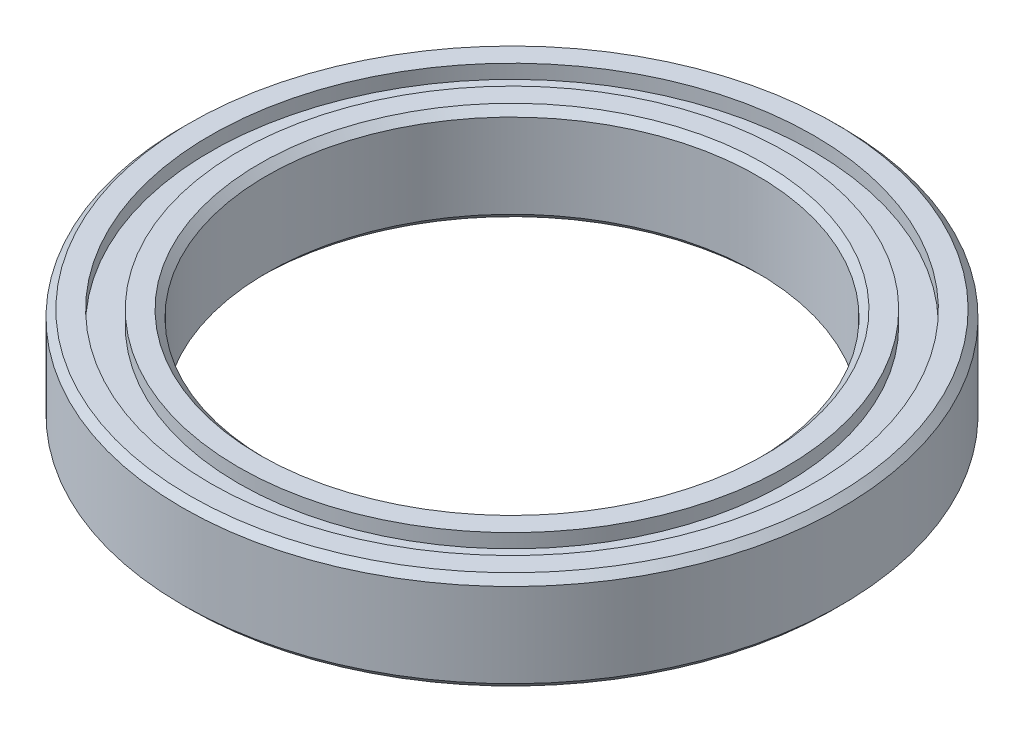
ISO-10303-21;
HEADER;
FILE_DESCRIPTION(('STEP AP214'),'2;1');
FILE_NAME('part.step','',(''),(''),'','','');
FILE_SCHEMA(('AUTOMOTIVE_DESIGN { 1 0 10303 214 1 1 1 1 }'));
ENDSEC;
DATA;
#1=APPLICATION_CONTEXT('core data for automotive mechanical design processes');
#2=APPLICATION_PROTOCOL_DEFINITION('international standard','automotive_design',2000,#1);
#3=PRODUCT_CONTEXT('',#1,'mechanical');
#4=PRODUCT('Part','Part','',(#3));
#5=PRODUCT_RELATED_PRODUCT_CATEGORY('part','',(#4));
#6=PRODUCT_DEFINITION_FORMATION('','',#4);
#7=PRODUCT_DEFINITION_CONTEXT('part definition',#1,'design');
#8=PRODUCT_DEFINITION('design','',#6,#7);
#9=PRODUCT_DEFINITION_SHAPE('','',#8);
#10=(LENGTH_UNIT() NAMED_UNIT(*) SI_UNIT(.MILLI.,.METRE.));
#11=(NAMED_UNIT(*) PLANE_ANGLE_UNIT() SI_UNIT($,.RADIAN.));
#12=(NAMED_UNIT(*) SI_UNIT($,.STERADIAN.) SOLID_ANGLE_UNIT());
#13=UNCERTAINTY_MEASURE_WITH_UNIT(LENGTH_MEASURE(1.E-05),#10,'distance_accuracy_value','');
#14=(GEOMETRIC_REPRESENTATION_CONTEXT(3) GLOBAL_UNCERTAINTY_ASSIGNED_CONTEXT((#13)) GLOBAL_UNIT_ASSIGNED_CONTEXT((#10,
#11,#12)) REPRESENTATION_CONTEXT('',''));
#15=CARTESIAN_POINT('',(0.,0.,0.));
#16=DIRECTION('',(0.,0.,1.));
#17=DIRECTION('',(1.,0.,0.));
#18=AXIS2_PLACEMENT_3D('',#15,#16,#17);
#19=CARTESIAN_POINT('',(0.,0.,0.));
#20=DIRECTION('',(0.,1.,0.));
#21=DIRECTION('',(0.,0.,1.));
#22=AXIS2_PLACEMENT_3D('',#19,#20,#21);
#23=PLANE('',#22);
#24=CARTESIAN_POINT('',(0.,0.,0.));
#25=DIRECTION('',(0.,1.,0.));
#26=DIRECTION('',(0.,0.,1.));
#27=AXIS2_PLACEMENT_3D('',#24,#25,#26);
#28=CIRCLE('',#27,18.);
#29=CARTESIAN_POINT('',(0.,0.,18.));
#30=VERTEX_POINT('',#29);
#31=EDGE_CURVE('E51',#30,#30,#28,.T.);
#32=ORIENTED_EDGE('',*,*,#31,.T.);
#33=EDGE_LOOP('',(#32));
#34=FACE_BOUND('',#33,.T.);
#35=CARTESIAN_POINT('',(0.,0.,0.));
#36=DIRECTION('',(0.,-1.,0.));
#37=DIRECTION('',(0.,0.,-1.));
#38=AXIS2_PLACEMENT_3D('',#35,#36,#37);
#39=CIRCLE('',#38,19.5);
#40=CARTESIAN_POINT('',(0.,0.,-19.5));
#41=VERTEX_POINT('',#40);
#42=EDGE_CURVE('E95',#41,#41,#39,.T.);
#43=ORIENTED_EDGE('',*,*,#42,.T.);
#44=EDGE_LOOP('',(#43));
#45=FACE_BOUND('',#44,.T.);
#46=ADVANCED_FACE('F43',(#34,#45),#23,.F.);
#47=CARTESIAN_POINT('',(0.,7.,0.));
#48=DIRECTION('',(0.,1.,0.));
#49=DIRECTION('',(0.,0.,1.));
#50=AXIS2_PLACEMENT_3D('',#47,#48,#49);
#51=PLANE('',#50);
#52=CARTESIAN_POINT('',(0.,7.,0.));
#53=DIRECTION('',(0.,1.,0.));
#54=DIRECTION('',(0.,0.,1.));
#55=AXIS2_PLACEMENT_3D('',#52,#53,#54);
#56=CIRCLE('',#55,18.);
#57=CARTESIAN_POINT('',(0.,7.,18.));
#58=VERTEX_POINT('',#57);
#59=EDGE_CURVE('E67',#58,#58,#56,.F.);
#60=ORIENTED_EDGE('',*,*,#59,.T.);
#61=EDGE_LOOP('',(#60));
#62=FACE_BOUND('',#61,.T.);
#63=CARTESIAN_POINT('',(0.,7.,0.));
#64=DIRECTION('',(0.,1.,0.));
#65=DIRECTION('',(0.,0.,1.));
#66=AXIS2_PLACEMENT_3D('',#63,#64,#65);
#67=CIRCLE('',#66,19.5);
#68=CARTESIAN_POINT('',(0.,7.,19.5));
#69=VERTEX_POINT('',#68);
#70=EDGE_CURVE('E83',#69,#69,#67,.T.);
#71=ORIENTED_EDGE('',*,*,#70,.T.);
#72=EDGE_LOOP('',(#71));
#73=FACE_BOUND('',#72,.T.);
#74=ADVANCED_FACE('F129',(#62,#73),#51,.T.);
#75=CARTESIAN_POINT('',(0.,7.,0.));
#76=DIRECTION('',(0.,1.,0.));
#77=DIRECTION('',(0.,0.,1.));
#78=AXIS2_PLACEMENT_3D('',#75,#76,#77);
#79=CIRCLE('',#78,23.);
#80=CARTESIAN_POINT('',(0.,7.,23.));
#81=VERTEX_POINT('',#80);
#82=EDGE_CURVE('E64',#81,#81,#79,.T.);
#83=ORIENTED_EDGE('',*,*,#82,.T.);
#84=EDGE_LOOP('',(#83));
#85=FACE_BOUND('',#84,.T.);
#86=CARTESIAN_POINT('',(0.,7.,0.));
#87=DIRECTION('',(0.,1.,0.));
#88=DIRECTION('',(0.,0.,1.));
#89=AXIS2_PLACEMENT_3D('',#86,#87,#88);
#90=CIRCLE('',#89,21.5);
#91=CARTESIAN_POINT('',(0.,7.,21.5));
#92=VERTEX_POINT('',#91);
#93=EDGE_CURVE('E77',#92,#92,#90,.T.);
#94=ORIENTED_EDGE('',*,*,#93,.F.);
#95=EDGE_LOOP('',(#94));
#96=FACE_BOUND('',#95,.T.);
#97=ADVANCED_FACE('F120',(#85,#96),#51,.T.);
#98=CARTESIAN_POINT('',(0.,0.,0.));
#99=DIRECTION('',(0.,1.,0.));
#100=DIRECTION('',(0.,0.,1.));
#101=AXIS2_PLACEMENT_3D('',#98,#99,#100);
#102=CIRCLE('',#101,23.);
#103=CARTESIAN_POINT('',(0.,0.,23.));
#104=VERTEX_POINT('',#103);
#105=EDGE_CURVE('E10',#104,#104,#102,.F.);
#106=ORIENTED_EDGE('',*,*,#105,.T.);
#107=EDGE_LOOP('',(#106));
#108=FACE_BOUND('',#107,.T.);
#109=CARTESIAN_POINT('',(0.,0.,0.));
#110=DIRECTION('',(0.,-1.,0.));
#111=DIRECTION('',(0.,0.,-1.));
#112=AXIS2_PLACEMENT_3D('',#109,#110,#111);
#113=CIRCLE('',#112,21.5);
#114=CARTESIAN_POINT('',(0.,0.,-21.5));
#115=VERTEX_POINT('',#114);
#116=EDGE_CURVE('E89',#115,#115,#113,.T.);
#117=ORIENTED_EDGE('',*,*,#116,.F.);
#118=EDGE_LOOP('',(#117));
#119=FACE_BOUND('',#118,.T.);
#120=ADVANCED_FACE('F117',(#108,#119),#23,.F.);
#121=CARTESIAN_POINT('',(0.,7.,0.));
#122=DIRECTION('',(0.,-1.,0.));
#123=DIRECTION('',(0.,0.,-1.));
#124=AXIS2_PLACEMENT_3D('',#121,#122,#123);
#125=CYLINDRICAL_SURFACE('',#124,23.5);
#126=CARTESIAN_POINT('',(0.,6.50000000000001,0.));
#127=DIRECTION('',(0.,1.,0.));
#128=DIRECTION('',(0.,0.,1.));
#129=AXIS2_PLACEMENT_3D('',#126,#127,#128);
#130=CIRCLE('',#129,23.5);
#131=CARTESIAN_POINT('',(0.,6.50000000000001,23.5));
#132=VERTEX_POINT('',#131);
#133=EDGE_CURVE('E55',#132,#132,#130,.F.);
#134=ORIENTED_EDGE('',*,*,#133,.T.);
#135=EDGE_LOOP('',(#134));
#136=FACE_BOUND('',#135,.T.);
#137=CARTESIAN_POINT('',(0.,0.499999999999997,0.));
#138=DIRECTION('',(0.,1.,0.));
#139=DIRECTION('',(0.,0.,1.));
#140=AXIS2_PLACEMENT_3D('',#137,#138,#139);
#141=CIRCLE('',#140,23.5);
#142=CARTESIAN_POINT('',(0.,0.499999999999997,23.5));
#143=VERTEX_POINT('',#142);
#144=EDGE_CURVE('E59',#143,#143,#141,.T.);
#145=ORIENTED_EDGE('',*,*,#144,.T.);
#146=EDGE_LOOP('',(#145));
#147=FACE_BOUND('',#146,.T.);
#148=ADVANCED_FACE('F119',(#136,#147),#125,.T.);
#149=CARTESIAN_POINT('',(0.,7.,0.));
#150=DIRECTION('',(0.,-1.,0.));
#151=DIRECTION('',(0.,0.,-1.));
#152=AXIS2_PLACEMENT_3D('',#149,#150,#151);
#153=CYLINDRICAL_SURFACE('',#152,17.5);
#154=CARTESIAN_POINT('',(0.,6.5,0.));
#155=DIRECTION('',(0.,1.,0.));
#156=DIRECTION('',(0.,0.,1.));
#157=AXIS2_PLACEMENT_3D('',#154,#155,#156);
#158=CIRCLE('',#157,17.5);
#159=CARTESIAN_POINT('',(0.,6.5,17.5));
#160=VERTEX_POINT('',#159);
#161=EDGE_CURVE('E70',#160,#160,#158,.T.);
#162=ORIENTED_EDGE('',*,*,#161,.T.);
#163=EDGE_LOOP('',(#162));
#164=FACE_BOUND('',#163,.T.);
#165=CARTESIAN_POINT('',(0.,0.500000000000004,0.));
#166=DIRECTION('',(0.,1.,0.));
#167=DIRECTION('',(0.,0.,1.));
#168=AXIS2_PLACEMENT_3D('',#165,#166,#167);
#169=CIRCLE('',#168,17.5);
#170=CARTESIAN_POINT('',(0.,0.500000000000004,17.5));
#171=VERTEX_POINT('',#170);
#172=EDGE_CURVE('E73',#171,#171,#169,.F.);
#173=ORIENTED_EDGE('',*,*,#172,.T.);
#174=EDGE_LOOP('',(#173));
#175=FACE_BOUND('',#174,.T.);
#176=ADVANCED_FACE('F126',(#164,#175),#153,.F.);
#177=CARTESIAN_POINT('',(0.,6.,0.));
#178=DIRECTION('',(0.,1.,0.));
#179=DIRECTION('',(0.,0.,1.));
#180=AXIS2_PLACEMENT_3D('',#177,#178,#179);
#181=CYLINDRICAL_SURFACE('',#180,21.5);
#182=CARTESIAN_POINT('',(0.,6.,0.));
#183=DIRECTION('',(0.,1.,0.));
#184=DIRECTION('',(0.,0.,1.));
#185=AXIS2_PLACEMENT_3D('',#182,#183,#184);
#186=CIRCLE('',#185,21.5);
#187=CARTESIAN_POINT('',(0.,6.,21.5));
#188=VERTEX_POINT('',#187);
#189=EDGE_CURVE('E76',#188,#188,#186,.T.);
#190=ORIENTED_EDGE('',*,*,#189,.F.);
#191=EDGE_LOOP('',(#190));
#192=FACE_BOUND('',#191,.T.);
#193=ORIENTED_EDGE('',*,*,#93,.T.);
#194=EDGE_LOOP('',(#193));
#195=FACE_BOUND('',#194,.T.);
#196=ADVANCED_FACE('F155',(#192,#195),#181,.F.);
#197=CARTESIAN_POINT('',(0.,6.,0.));
#198=DIRECTION('',(0.,1.,0.));
#199=DIRECTION('',(0.,0.,1.));
#200=AXIS2_PLACEMENT_3D('',#197,#198,#199);
#201=PLANE('',#200);
#202=CARTESIAN_POINT('',(0.,6.,0.));
#203=DIRECTION('',(0.,1.,0.));
#204=DIRECTION('',(0.,0.,1.));
#205=AXIS2_PLACEMENT_3D('',#202,#203,#204);
#206=CIRCLE('',#205,19.5);
#207=CARTESIAN_POINT('',(0.,6.,19.5));
#208=VERTEX_POINT('',#207);
#209=EDGE_CURVE('E80',#208,#208,#206,.T.);
#210=ORIENTED_EDGE('',*,*,#209,.F.);
#211=EDGE_LOOP('',(#210));
#212=FACE_BOUND('',#211,.T.);
#213=ORIENTED_EDGE('',*,*,#189,.T.);
#214=EDGE_LOOP('',(#213));
#215=FACE_BOUND('',#214,.T.);
#216=ADVANCED_FACE('F151',(#212,#215),#201,.T.);
#217=CARTESIAN_POINT('',(0.,6.,0.));
#218=DIRECTION('',(0.,1.,0.));
#219=DIRECTION('',(0.,0.,1.));
#220=AXIS2_PLACEMENT_3D('',#217,#218,#219);
#221=CYLINDRICAL_SURFACE('',#220,19.5);
#222=ORIENTED_EDGE('',*,*,#209,.T.);
#223=EDGE_LOOP('',(#222));
#224=FACE_BOUND('',#223,.T.);
#225=ORIENTED_EDGE('',*,*,#70,.F.);
#226=EDGE_LOOP('',(#225));
#227=FACE_BOUND('',#226,.T.);
#228=ADVANCED_FACE('F113',(#224,#227),#221,.T.);
#229=CARTESIAN_POINT('',(0.,1.,0.));
#230=DIRECTION('',(0.,-1.,0.));
#231=DIRECTION('',(0.,0.,-1.));
#232=AXIS2_PLACEMENT_3D('',#229,#230,#231);
#233=CYLINDRICAL_SURFACE('',#232,21.5);
#234=CARTESIAN_POINT('',(0.,1.,0.));
#235=DIRECTION('',(0.,-1.,0.));
#236=DIRECTION('',(0.,0.,-1.));
#237=AXIS2_PLACEMENT_3D('',#234,#235,#236);
#238=CIRCLE('',#237,21.5);
#239=CARTESIAN_POINT('',(0.,1.,-21.5));
#240=VERTEX_POINT('',#239);
#241=EDGE_CURVE('E86',#240,#240,#238,.T.);
#242=ORIENTED_EDGE('',*,*,#241,.F.);
#243=EDGE_LOOP('',(#242));
#244=FACE_BOUND('',#243,.T.);
#245=ORIENTED_EDGE('',*,*,#116,.T.);
#246=EDGE_LOOP('',(#245));
#247=FACE_BOUND('',#246,.T.);
#248=ADVANCED_FACE('F107',(#244,#247),#233,.F.);
#249=CARTESIAN_POINT('',(0.,1.,0.));
#250=DIRECTION('',(0.,-1.,0.));
#251=DIRECTION('',(0.,0.,-1.));
#252=AXIS2_PLACEMENT_3D('',#249,#250,#251);
#253=PLANE('',#252);
#254=CARTESIAN_POINT('',(0.,1.,0.));
#255=DIRECTION('',(0.,-1.,0.));
#256=DIRECTION('',(0.,0.,-1.));
#257=AXIS2_PLACEMENT_3D('',#254,#255,#256);
#258=CIRCLE('',#257,19.5);
#259=CARTESIAN_POINT('',(0.,1.,-19.5));
#260=VERTEX_POINT('',#259);
#261=EDGE_CURVE('E92',#260,#260,#258,.T.);
#262=ORIENTED_EDGE('',*,*,#261,.F.);
#263=EDGE_LOOP('',(#262));
#264=FACE_BOUND('',#263,.T.);
#265=ORIENTED_EDGE('',*,*,#241,.T.);
#266=EDGE_LOOP('',(#265));
#267=FACE_BOUND('',#266,.T.);
#268=ADVANCED_FACE('F104',(#264,#267),#253,.T.);
#269=CARTESIAN_POINT('',(0.,1.,0.));
#270=DIRECTION('',(0.,-1.,0.));
#271=DIRECTION('',(0.,0.,-1.));
#272=AXIS2_PLACEMENT_3D('',#269,#270,#271);
#273=CYLINDRICAL_SURFACE('',#272,19.5);
#274=ORIENTED_EDGE('',*,*,#261,.T.);
#275=EDGE_LOOP('',(#274));
#276=FACE_BOUND('',#275,.T.);
#277=ORIENTED_EDGE('',*,*,#42,.F.);
#278=EDGE_LOOP('',(#277));
#279=FACE_BOUND('',#278,.T.);
#280=ADVANCED_FACE('F101',(#276,#279),#273,.T.);
#281=CARTESIAN_POINT('',(0.,6.5,0.));
#282=DIRECTION('',(0.,1.,0.));
#283=DIRECTION('',(0.,0.,1.));
#284=AXIS2_PLACEMENT_3D('',#281,#282,#283);
#285=CONICAL_SURFACE('',#284,17.5,0.785398163397452);
#286=ORIENTED_EDGE('',*,*,#59,.F.);
#287=EDGE_LOOP('',(#286));
#288=FACE_BOUND('',#287,.T.);
#289=ORIENTED_EDGE('',*,*,#161,.F.);
#290=EDGE_LOOP('',(#289));
#291=FACE_BOUND('',#290,.T.);
#292=ADVANCED_FACE('F140',(#288,#291),#285,.F.);
#293=CARTESIAN_POINT('',(0.,7.,0.));
#294=DIRECTION('',(0.,-1.,0.));
#295=DIRECTION('',(0.,0.,-1.));
#296=AXIS2_PLACEMENT_3D('',#293,#294,#295);
#297=CONICAL_SURFACE('',#296,23.,0.785398163397445);
#298=ORIENTED_EDGE('',*,*,#133,.F.);
#299=EDGE_LOOP('',(#298));
#300=FACE_BOUND('',#299,.T.);
#301=ORIENTED_EDGE('',*,*,#82,.F.);
#302=EDGE_LOOP('',(#301));
#303=FACE_BOUND('',#302,.T.);
#304=ADVANCED_FACE('F145',(#300,#303),#297,.T.);
#305=CARTESIAN_POINT('',(0.,0.,0.));
#306=DIRECTION('',(0.,-1.,0.));
#307=DIRECTION('',(0.,0.,-1.));
#308=AXIS2_PLACEMENT_3D('',#305,#306,#307);
#309=CONICAL_SURFACE('',#308,18.,0.785398163397441);
#310=ORIENTED_EDGE('',*,*,#172,.F.);
#311=EDGE_LOOP('',(#310));
#312=FACE_BOUND('',#311,.T.);
#313=ORIENTED_EDGE('',*,*,#31,.F.);
#314=EDGE_LOOP('',(#313));
#315=FACE_BOUND('',#314,.T.);
#316=ADVANCED_FACE('F168',(#312,#315),#309,.F.);
#317=CARTESIAN_POINT('',(0.,0.499999999999997,0.));
#318=DIRECTION('',(0.,1.,0.));
#319=DIRECTION('',(0.,0.,1.));
#320=AXIS2_PLACEMENT_3D('',#317,#318,#319);
#321=CONICAL_SURFACE('',#320,23.5,0.785398163397452);
#322=ORIENTED_EDGE('',*,*,#105,.F.);
#323=EDGE_LOOP('',(#322));
#324=FACE_BOUND('',#323,.T.);
#325=ORIENTED_EDGE('',*,*,#144,.F.);
#326=EDGE_LOOP('',(#325));
#327=FACE_BOUND('',#326,.T.);
#328=ADVANCED_FACE('F46',(#324,#327),#321,.T.);
#329=CLOSED_SHELL('',(#46,#74,#97,#120,#148,#176,#196,#216,#228,#248,#268,#280,#292,#304,#316,#328));
#330=MANIFOLD_SOLID_BREP('B2',#329);
#331=ADVANCED_BREP_SHAPE_REPRESENTATION('',(#18,#330),#14);
#332=SHAPE_DEFINITION_REPRESENTATION(#9,#331);
ENDSEC;
END-ISO-10303-21;
